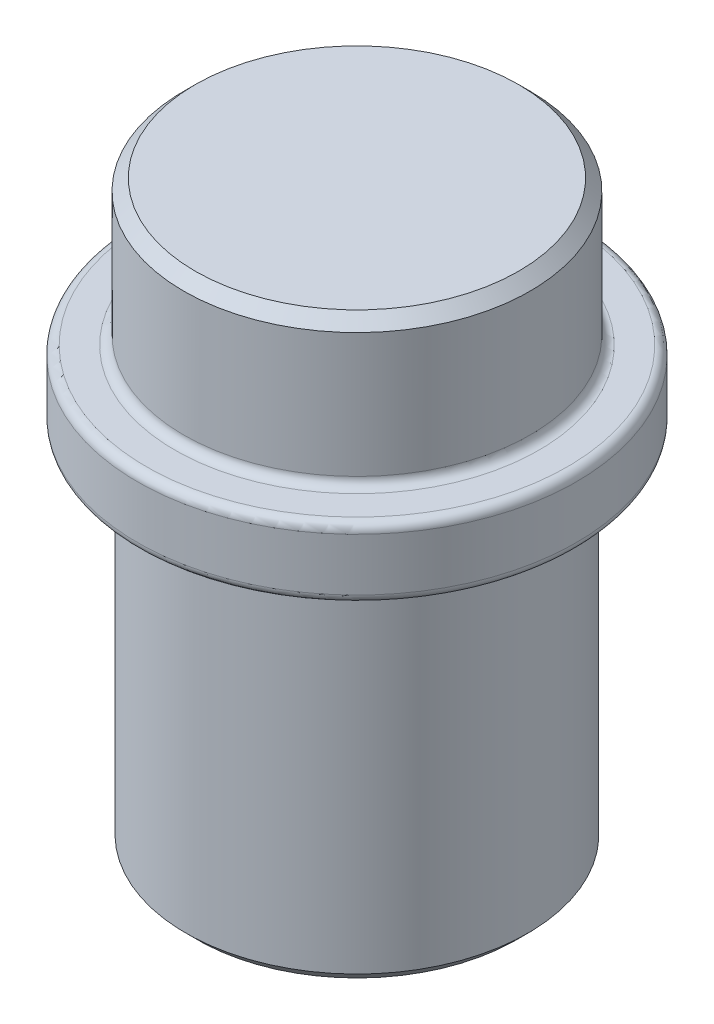
ISO-10303-21;
HEADER;
FILE_DESCRIPTION(('STEP AP214'),'2;1');
FILE_NAME('part.step','',(''),(''),'','','');
FILE_SCHEMA(('AUTOMOTIVE_DESIGN { 1 0 10303 214 1 1 1 1 }'));
ENDSEC;
DATA;
#1=APPLICATION_CONTEXT('core data for automotive mechanical design processes');
#2=APPLICATION_PROTOCOL_DEFINITION('international standard','automotive_design',2000,#1);
#3=PRODUCT_CONTEXT('',#1,'mechanical');
#4=PRODUCT('Part','Part','',(#3));
#5=PRODUCT_RELATED_PRODUCT_CATEGORY('part','',(#4));
#6=PRODUCT_DEFINITION_FORMATION('','',#4);
#7=PRODUCT_DEFINITION_CONTEXT('part definition',#1,'design');
#8=PRODUCT_DEFINITION('design','',#6,#7);
#9=PRODUCT_DEFINITION_SHAPE('','',#8);
#10=(LENGTH_UNIT() NAMED_UNIT(*) SI_UNIT(.MILLI.,.METRE.));
#11=(NAMED_UNIT(*) PLANE_ANGLE_UNIT() SI_UNIT($,.RADIAN.));
#12=(NAMED_UNIT(*) SI_UNIT($,.STERADIAN.) SOLID_ANGLE_UNIT());
#13=UNCERTAINTY_MEASURE_WITH_UNIT(LENGTH_MEASURE(1.E-05),#10,'distance_accuracy_value','');
#14=(GEOMETRIC_REPRESENTATION_CONTEXT(3) GLOBAL_UNCERTAINTY_ASSIGNED_CONTEXT((#13)) GLOBAL_UNIT_ASSIGNED_CONTEXT((#10,
#11,#12)) REPRESENTATION_CONTEXT('',''));
#15=CARTESIAN_POINT('',(0.,0.,0.));
#16=DIRECTION('',(0.,0.,1.));
#17=DIRECTION('',(1.,0.,0.));
#18=AXIS2_PLACEMENT_3D('',#15,#16,#17);
#19=CARTESIAN_POINT('',(0.,-25.4,0.));
#20=DIRECTION('',(0.,-1.,0.));
#21=DIRECTION('',(0.,0.,-1.));
#22=AXIS2_PLACEMENT_3D('',#19,#20,#21);
#23=CYLINDRICAL_SURFACE('',#22,7.5311);
#24=CARTESIAN_POINT('',(0.,69.34962,0.));
#25=DIRECTION('',(0.,-1.,0.));
#26=DIRECTION('',(0.,0.,-1.));
#27=AXIS2_PLACEMENT_3D('',#24,#25,#26);
#28=CIRCLE('',#27,7.5311);
#29=CARTESIAN_POINT('',(0.,69.34962,-7.5311));
#30=VERTEX_POINT('',#29);
#31=EDGE_CURVE('E191',#30,#30,#28,.T.);
#32=ORIENTED_EDGE('',*,*,#31,.T.);
#33=EDGE_LOOP('',(#32));
#34=FACE_BOUND('',#33,.T.);
#35=CARTESIAN_POINT('',(0.,66.04,0.));
#36=DIRECTION('',(0.,1.,0.));
#37=DIRECTION('',(0.,0.,1.));
#38=AXIS2_PLACEMENT_3D('',#35,#36,#37);
#39=CIRCLE('',#38,7.5311);
#40=CARTESIAN_POINT('',(-7.19565243901508,66.04,2.22262304201505));
#41=VERTEX_POINT('',#40);
#42=CARTESIAN_POINT('',(-7.1964932060148,66.04,-2.21989926478269));
#43=VERTEX_POINT('',#42);
#44=EDGE_CURVE('E11',#41,#43,#39,.F.);
#45=ORIENTED_EDGE('',*,*,#44,.F.);
#46=DIRECTION('',(0.,-1.,0.));
#47=VECTOR('',#46,1.);
#48=CARTESIAN_POINT('',(-7.19565243901498,64.9859,2.22262304201538));
#49=LINE('',#48,#47);
#50=CARTESIAN_POINT('',(-7.19565243901507,63.9317999999979,2.22262304201508));
#51=VERTEX_POINT('',#50);
#52=EDGE_CURVE('E149',#41,#51,#49,.T.);
#53=ORIENTED_EDGE('',*,*,#52,.T.);
#54=CARTESIAN_POINT('',(0.,63.9318,0.));
#55=DIRECTION('',(0.,-1.,0.));
#56=DIRECTION('',(0.,0.,-1.));
#57=AXIS2_PLACEMENT_3D('',#54,#55,#56);
#58=CIRCLE('',#57,7.5311);
#59=CARTESIAN_POINT('',(-7.19649320601479,63.9318000000152,-2.21989926478274));
#60=VERTEX_POINT('',#59);
#61=EDGE_CURVE('E188',#60,#51,#58,.T.);
#62=ORIENTED_EDGE('',*,*,#61,.F.);
#63=DIRECTION('',(0.,-1.,0.));
#64=VECTOR('',#63,1.);
#65=CARTESIAN_POINT('',(-7.19649320601468,64.9859,-2.21989926478307));
#66=LINE('',#65,#64);
#67=EDGE_CURVE('E124',#60,#43,#66,.F.);
#68=ORIENTED_EDGE('',*,*,#67,.T.);
#69=EDGE_LOOP('',(#45,#53,#62,#68));
#70=FACE_BOUND('',#69,.T.);
#71=ADVANCED_FACE('F43',(#34,#70),#23,.T.);
#72=CARTESIAN_POINT('',(0.,63.9318,0.));
#73=DIRECTION('',(0.,-1.,0.));
#74=DIRECTION('',(0.,0.,-1.));
#75=AXIS2_PLACEMENT_3D('',#72,#73,#74);
#76=TOROIDAL_SURFACE('',#75,7.9121,0.381000000000004);
#77=ORIENTED_EDGE('',*,*,#61,.T.);
#78=CARTESIAN_POINT('',(-7.19565392150481,63.932,2.222618420377));
#79=CARTESIAN_POINT('',(-7.19564887805347,63.9316982296135,2.22263415915682));
#80=CARTESIAN_POINT('',(-7.19565508411614,63.9313972408078,2.2226147958262));
#81=CARTESIAN_POINT('',(-7.19568550587122,63.9308125680004,2.22251996706615));
#82=CARTESIAN_POINT('',(-7.19570926468576,63.9305286391639,2.22244592488398));
#83=CARTESIAN_POINT('',(-7.19578182753611,63.9298755776215,2.22221993724098));
#84=CARTESIAN_POINT('',(-7.19583665542731,63.9295139529192,2.22204927388934));
#85=CARTESIAN_POINT('',(-7.19596248814146,63.9288176984729,2.22165806257884));
#86=CARTESIAN_POINT('',(-7.19603368395775,63.9284834562325,2.22143692589767));
#87=CARTESIAN_POINT('',(-7.19637441752574,63.9270237920419,2.22038015406093));
#88=CARTESIAN_POINT('',(-7.19669251800118,63.9260223633533,2.21939760035131));
#89=CARTESIAN_POINT('',(-7.19735620851469,63.9241152038425,2.21735942010747));
#90=CARTESIAN_POINT('',(-7.1977019198329,63.9232099410894,2.21630347416516));
#91=CARTESIAN_POINT('',(-7.20081427695179,63.9153006868265,2.20685472456738));
#92=CARTESIAN_POINT('',(-7.20389747793767,63.9091206552501,2.19789127203985));
#93=CARTESIAN_POINT('',(-7.21349965653869,63.8905170773389,2.17121316786694));
#94=CARTESIAN_POINT('',(-7.22037006911947,63.878032602792,2.1537146024011));
#95=CARTESIAN_POINT('',(-7.23516544839203,63.8533579960951,2.1189477512049));
#96=CARTESIAN_POINT('',(-7.24308962650045,63.8411676518154,2.10167930379566));
#97=CARTESIAN_POINT('',(-7.26465307332196,63.8102562936931,2.05802766336985));
#98=CARTESIAN_POINT('',(-7.27902240155873,63.7916678944851,2.0319080671607));
#99=CARTESIAN_POINT('',(-7.31032870972903,63.755344624653,1.9806214980743));
#100=CARTESIAN_POINT('',(-7.32726771142415,63.7376104407102,1.95545529496297));
#101=CARTESIAN_POINT('',(-7.38202256084108,63.6862844299909,1.88172312915843));
#102=CARTESIAN_POINT('',(-7.42387504693956,63.654419664563,1.83471836776791));
#103=CARTESIAN_POINT('',(-7.49470368921049,63.614054797531,1.76948420666288));
#104=CARTESIAN_POINT('',(-7.51938743488396,63.6019186381813,1.74878829227356));
#105=CARTESIAN_POINT('',(-7.57155672542215,63.5807995437159,1.70928957199155));
#106=CARTESIAN_POINT('',(-7.59904386707893,63.5718184187719,1.69048785727571));
#107=CARTESIAN_POINT('',(-7.65699596492557,63.5580537363401,1.65505861739462));
#108=CARTESIAN_POINT('',(-7.68749821740486,63.5533327217491,1.63846644289689));
#109=CARTESIAN_POINT('',(-7.75030380168546,63.5498207445377,1.60849989643333));
#110=CARTESIAN_POINT('',(-7.78259664982927,63.5509982608332,1.59510882010798));
#111=CARTESIAN_POINT('',(-7.83131254617507,63.5582682635789,1.5777767048861));
#112=CARTESIAN_POINT('',(-7.84766691389278,63.561634914718,1.5724418100122));
#113=CARTESIAN_POINT('',(-7.88020622664097,63.5703711323364,1.56271373343094));
#114=CARTESIAN_POINT('',(-7.89638998775283,63.5757501982905,1.55832517624662));
#115=CARTESIAN_POINT('',(-7.9123,63.5821921897,1.55443093974947));
#116=B_SPLINE_CURVE_WITH_KNOTS('',3,(#78,#79,#80,#81,#82,#83,#84,#85,#86,#87,#88,#89,#90,#91,
#92,#93,#94,#95,#96,#97,#98,#99,#100,#101,#102,#103,#104,#105,#106,#107,#108,#109,#110,#111,
#112,#113,#114,#115),.UNSPECIFIED.,.F.,.F.,(4,2,2,2,2,2,2,2,2,2,2,2,2,2,2,2,2,2,4),(0.,
0.00090045342468098,0.00177825994486462,0.00298200107736237,0.00420057355602642,
0.00848338047893281,0.012786160390775,0.0466467514337602,0.114382071607839,0.182066984485264,
0.287338335510166,0.39269294540657,0.602593502708833,0.7056315327309,0.808728583687365,
0.913315682308793,1.01734447741844,1.06980368325487,1.12251370963707),.UNSPECIFIED.);
#117=CARTESIAN_POINT('',(-7.74638180037426,63.5508,1.61086790669825));
#118=VERTEX_POINT('',#117);
#119=EDGE_CURVE('E142',#51,#118,#116,.T.);
#120=ORIENTED_EDGE('',*,*,#119,.T.);
#121=CARTESIAN_POINT('',(0.,63.5508,0.));
#122=DIRECTION('',(0.,-1.,0.));
#123=DIRECTION('',(0.,0.,-1.));
#124=AXIS2_PLACEMENT_3D('',#121,#122,#123);
#125=CIRCLE('',#124,7.9121);
#126=CARTESIAN_POINT('',(-7.74650459269297,63.5508,-1.61027730698371));
#127=VERTEX_POINT('',#126);
#128=EDGE_CURVE('E185',#127,#118,#125,.T.);
#129=ORIENTED_EDGE('',*,*,#128,.F.);
#130=CARTESIAN_POINT('',(-7.9123,63.5821922487398,-1.55443164676201));
#131=CARTESIAN_POINT('',(-7.88976496843398,63.5730459925189,-1.55984145030963));
#132=CARTESIAN_POINT('',(-7.86671105132023,63.566068132639,-1.56627759626164));
#133=CARTESIAN_POINT('',(-7.82058421192799,63.5560633913314,-1.58100671511895));
#134=CARTESIAN_POINT('',(-7.79751366957904,63.5529986262405,-1.58928095915709));
#135=CARTESIAN_POINT('',(-7.74686317635095,63.5499719094482,-1.60962475245245));
#136=CARTESIAN_POINT('',(-7.7194130873967,63.5508450935852,-1.62212893334892));
#137=CARTESIAN_POINT('',(-7.66603961769109,63.5566710018842,-1.64939185229539));
#138=CARTESIAN_POINT('',(-7.6401226963378,63.5616398280319,-1.66415930150468));
#139=CARTESIAN_POINT('',(-7.57982882653366,63.5775077906599,-1.70210902017465));
#140=CARTESIAN_POINT('',(-7.54646839693582,63.5900208904836,-1.72622113986055));
#141=CARTESIAN_POINT('',(-7.48407606067448,63.6193962958821,-1.77720322072982));
#142=CARTESIAN_POINT('',(-7.45505319512952,63.6362674911609,-1.80407875050084));
#143=CARTESIAN_POINT('',(-7.38764288788742,63.6821746774853,-1.87404831693592));
#144=CARTESIAN_POINT('',(-7.35191619652075,63.7130541685286,-1.91848516915673));
#145=CARTESIAN_POINT('',(-7.28937660096177,63.7781792995054,-2.0108038524957));
#146=CARTESIAN_POINT('',(-7.26255671484251,63.8124222754315,-2.05868294929559));
#147=CARTESIAN_POINT('',(-7.23348686574313,63.8573685412151,-2.12200085905956));
#148=CARTESIAN_POINT('',(-7.22736363250432,63.8674278061453,-2.1362013566518));
#149=CARTESIAN_POINT('',(-7.21793238996297,63.8839433249014,-2.15954595521695));
#150=CARTESIAN_POINT('',(-7.21441693545656,63.89036473938,-2.16862987750942));
#151=CARTESIAN_POINT('',(-7.20894327082859,63.9008525105362,-2.18341026914401));
#152=CARTESIAN_POINT('',(-7.20689770102963,63.9048938878128,-2.1890924870053));
#153=CARTESIAN_POINT('',(-7.20368304432382,63.9115173939244,-2.19828141052459));
#154=CARTESIAN_POINT('',(-7.20247607482472,63.9140709363366,-2.20179492865012));
#155=CARTESIAN_POINT('',(-7.20057052223172,63.918306870803,-2.20744287779158));
#156=CARTESIAN_POINT('',(-7.19985204895762,63.919954160814,-2.20959713689689));
#157=CARTESIAN_POINT('',(-7.19871732003669,63.9227465992726,-2.21303753487519));
#158=CARTESIAN_POINT('',(-7.19828771928923,63.9238516624994,-2.21434959178583));
#159=CARTESIAN_POINT('',(-7.19767519583938,63.9256235150572,-2.21623254437705));
#160=CARTESIAN_POINT('',(-7.19747542149911,63.926236514628,-2.21684885600262));
#161=CARTESIAN_POINT('',(-7.19709916890756,63.9275327213009,-2.21801321567947));
#162=CARTESIAN_POINT('',(-7.1969225568408,63.9282154805172,-2.2185616547096));
#163=CARTESIAN_POINT('',(-7.19672975436063,63.929219589595,-2.21916166244581));
#164=CARTESIAN_POINT('',(-7.19668484907151,63.9294803493572,-2.21930154349647));
#165=CARTESIAN_POINT('',(-7.19660667457906,63.9300185933403,-2.21954519938292));
#166=CARTESIAN_POINT('',(-7.19657333456141,63.9302959631308,-2.21964919393109));
#167=CARTESIAN_POINT('',(-7.19652770443402,63.9308092356625,-2.21979156788783));
#168=CARTESIAN_POINT('',(-7.19651253416542,63.9310423028534,-2.21983892230518));
#169=CARTESIAN_POINT('',(-7.19649399541484,63.9315169286096,-2.21989680062555));
#170=CARTESIAN_POINT('',(-7.19649081184256,63.9317585626208,-2.2199067474675));
#171=CARTESIAN_POINT('',(-7.19649469408532,63.9320000001165,-2.21989461882009));
#172=B_SPLINE_CURVE_WITH_KNOTS('',3,(#130,#131,#132,#133,#134,#135,#136,#137,#138,#139,#140,
#141,#142,#143,#144,#145,#146,#147,#148,#149,#150,#151,#152,#153,#154,#155,#156,#157,#158,#159,
#160,#161,#162,#163,#164,#165,#166,#167,#168,#169,#170,#171),.UNSPECIFIED.,.F.,.F.,(4,2,2,2,2,2,
2,2,2,2,2,2,2,2,2,2,2,2,2,2,4),(0.,0.0744747040376915,0.148222792514042,0.238264706269916,
0.328662317120564,0.457013237484078,0.585628066203248,0.779117917401475,0.972455734463609,
1.02779283861518,1.06278802075029,1.08458766980801,1.09810986688792,1.10652659593674,
1.1118248711336,1.11450076497588,1.11716044577238,1.11805634404342,1.11894665565747,
1.11965846797852,1.12038121693569),.UNSPECIFIED.);
#173=EDGE_CURVE('E102',#127,#60,#172,.T.);
#174=ORIENTED_EDGE('',*,*,#173,.T.);
#175=EDGE_LOOP('',(#77,#120,#129,#174));
#176=FACE_BOUND('',#175,.T.);
#177=ADVANCED_FACE('F126',(#176),#76,.F.);
#178=CARTESIAN_POINT('',(7.03072,69.85,0.));
#179=DIRECTION('',(0.,1.,0.));
#180=DIRECTION('',(0.,0.,1.));
#181=AXIS2_PLACEMENT_3D('',#178,#179,#180);
#182=PLANE('',#181);
#183=CARTESIAN_POINT('',(0.,69.85,0.));
#184=DIRECTION('',(0.,-1.,0.));
#185=DIRECTION('',(0.,0.,-1.));
#186=AXIS2_PLACEMENT_3D('',#183,#184,#185);
#187=CIRCLE('',#186,7.03072);
#188=CARTESIAN_POINT('',(0.,69.85,-7.03072));
#189=VERTEX_POINT('',#188);
#190=EDGE_CURVE('E194',#189,#189,#187,.T.);
#191=ORIENTED_EDGE('',*,*,#190,.F.);
#192=EDGE_LOOP('',(#191));
#193=FACE_BOUND('',#192,.T.);
#194=ADVANCED_FACE('F45',(#193),#182,.T.);
#195=CARTESIAN_POINT('',(0.,69.34962,0.));
#196=DIRECTION('',(0.,-1.,0.));
#197=DIRECTION('',(0.,0.,-1.));
#198=AXIS2_PLACEMENT_3D('',#195,#196,#197);
#199=CONICAL_SURFACE('',#198,7.5311,0.785398163397453);
#200=ORIENTED_EDGE('',*,*,#190,.T.);
#201=EDGE_LOOP('',(#200));
#202=FACE_BOUND('',#201,.T.);
#203=ORIENTED_EDGE('',*,*,#31,.F.);
#204=EDGE_LOOP('',(#203));
#205=FACE_BOUND('',#204,.T.);
#206=ADVANCED_FACE('F210',(#202,#205),#199,.T.);
#207=CARTESIAN_POINT('',(9.1567,63.5508,0.));
#208=DIRECTION('',(0.,1.,0.));
#209=DIRECTION('',(0.,0.,1.));
#210=AXIS2_PLACEMENT_3D('',#207,#208,#209);
#211=PLANE('',#210);
#212=ORIENTED_EDGE('',*,*,#128,.T.);
#213=CARTESIAN_POINT('',(-8.15129724862775,63.5508,2.52916410286336));
#214=DIRECTION('',(0.,-1.,0.));
#215=DIRECTION('',(0.,0.,1.));
#216=AXIS2_PLACEMENT_3D('',#213,#214,#215);
#217=CIRCLE('',#216,1.00360571148516);
#218=CARTESIAN_POINT('',(-7.9121,63.5508,1.55448));
#219=VERTEX_POINT('',#218);
#220=EDGE_CURVE('E112',#219,#118,#217,.T.);
#221=ORIENTED_EDGE('',*,*,#220,.F.);
#222=CARTESIAN_POINT('',(-7.530719,63.5508,0.));
#223=DIRECTION('',(0.,1.,0.));
#224=DIRECTION('',(0.,0.,-1.));
#225=AXIS2_PLACEMENT_3D('',#222,#223,#224);
#226=CIRCLE('',#225,1.600581);
#227=CARTESIAN_POINT('',(-7.9121,63.5508,-1.55448));
#228=VERTEX_POINT('',#227);
#229=EDGE_CURVE('E114',#228,#219,#226,.T.);
#230=ORIENTED_EDGE('',*,*,#229,.F.);
#231=CARTESIAN_POINT('',(-8.14665828474617,63.5508,-2.52422866384649));
#232=DIRECTION('',(0.,1.,0.));
#233=DIRECTION('',(0.,0.,1.));
#234=AXIS2_PLACEMENT_3D('',#231,#232,#233);
#235=CIRCLE('',#234,0.997712413461473);
#236=EDGE_CURVE('E51',#228,#127,#235,.T.);
#237=ORIENTED_EDGE('',*,*,#236,.T.);
#238=EDGE_LOOP('',(#212,#221,#230,#237));
#239=FACE_BOUND('',#238,.T.);
#240=CARTESIAN_POINT('',(0.,63.5508,0.));
#241=DIRECTION('',(0.,-1.,0.));
#242=DIRECTION('',(0.,0.,-1.));
#243=AXIS2_PLACEMENT_3D('',#240,#241,#242);
#244=CIRCLE('',#243,9.1567);
#245=CARTESIAN_POINT('',(0.,63.5508,-9.1567));
#246=VERTEX_POINT('',#245);
#247=EDGE_CURVE('E182',#246,#246,#244,.T.);
#248=ORIENTED_EDGE('',*,*,#247,.F.);
#249=EDGE_LOOP('',(#248));
#250=FACE_BOUND('',#249,.T.);
#251=ADVANCED_FACE('F198',(#239,#250),#211,.T.);
#252=CARTESIAN_POINT('',(0.,63.1698,0.));
#253=DIRECTION('',(0.,-1.,0.));
#254=DIRECTION('',(0.,0.,-1.));
#255=AXIS2_PLACEMENT_3D('',#252,#253,#254);
#256=TOROIDAL_SURFACE('',#255,9.15670000000003,0.380999999999966);
#257=ORIENTED_EDGE('',*,*,#247,.T.);
#258=EDGE_LOOP('',(#257));
#259=FACE_BOUND('',#258,.T.);
#260=CARTESIAN_POINT('',(0.,63.1698,0.));
#261=DIRECTION('',(0.,-1.,0.));
#262=DIRECTION('',(0.,0.,-1.));
#263=AXIS2_PLACEMENT_3D('',#260,#261,#262);
#264=CIRCLE('',#263,9.5377);
#265=CARTESIAN_POINT('',(0.,63.1698,-9.5377));
#266=VERTEX_POINT('',#265);
#267=EDGE_CURVE('E179',#266,#266,#264,.T.);
#268=ORIENTED_EDGE('',*,*,#267,.F.);
#269=EDGE_LOOP('',(#268));
#270=FACE_BOUND('',#269,.T.);
#271=ADVANCED_FACE('F218',(#259,#270),#256,.T.);
#272=CARTESIAN_POINT('',(0.,-25.4,0.));
#273=DIRECTION('',(0.,-1.,0.));
#274=DIRECTION('',(0.,0.,-1.));
#275=AXIS2_PLACEMENT_3D('',#272,#273,#274);
#276=CYLINDRICAL_SURFACE('',#275,9.5377);
#277=ORIENTED_EDGE('',*,*,#267,.T.);
#278=EDGE_LOOP('',(#277));
#279=FACE_BOUND('',#278,.T.);
#280=CARTESIAN_POINT('',(0.,60.8838,0.));
#281=DIRECTION('',(0.,-1.,0.));
#282=DIRECTION('',(0.,0.,-1.));
#283=AXIS2_PLACEMENT_3D('',#280,#281,#282);
#284=CIRCLE('',#283,9.5377);
#285=CARTESIAN_POINT('',(0.,60.8838,-9.5377));
#286=VERTEX_POINT('',#285);
#287=EDGE_CURVE('E176',#286,#286,#284,.T.);
#288=ORIENTED_EDGE('',*,*,#287,.F.);
#289=EDGE_LOOP('',(#288));
#290=FACE_BOUND('',#289,.T.);
#291=ADVANCED_FACE('F244',(#279,#290),#276,.T.);
#292=CARTESIAN_POINT('',(0.,60.8838,0.));
#293=DIRECTION('',(0.,-1.,0.));
#294=DIRECTION('',(0.,0.,-1.));
#295=AXIS2_PLACEMENT_3D('',#292,#293,#294);
#296=TOROIDAL_SURFACE('',#295,9.15669999999999,0.381000000000012);
#297=ORIENTED_EDGE('',*,*,#287,.T.);
#298=EDGE_LOOP('',(#297));
#299=FACE_BOUND('',#298,.T.);
#300=CARTESIAN_POINT('',(0.,60.5028,0.));
#301=DIRECTION('',(0.,-1.,0.));
#302=DIRECTION('',(0.,0.,-1.));
#303=AXIS2_PLACEMENT_3D('',#300,#301,#302);
#304=CIRCLE('',#303,9.1567);
#305=CARTESIAN_POINT('',(0.,60.5028,-9.1567));
#306=VERTEX_POINT('',#305);
#307=EDGE_CURVE('E173',#306,#306,#304,.T.);
#308=ORIENTED_EDGE('',*,*,#307,.F.);
#309=EDGE_LOOP('',(#308));
#310=FACE_BOUND('',#309,.T.);
#311=ADVANCED_FACE('F254',(#299,#310),#296,.T.);
#312=CARTESIAN_POINT('',(7.81939,60.5028,0.));
#313=DIRECTION('',(0.,-1.,0.));
#314=DIRECTION('',(0.,0.,-1.));
#315=AXIS2_PLACEMENT_3D('',#312,#313,#314);
#316=PLANE('',#315);
#317=ORIENTED_EDGE('',*,*,#307,.T.);
#318=EDGE_LOOP('',(#317));
#319=FACE_BOUND('',#318,.T.);
#320=CARTESIAN_POINT('',(0.,60.5028,0.));
#321=DIRECTION('',(0.,-1.,0.));
#322=DIRECTION('',(0.,0.,-1.));
#323=AXIS2_PLACEMENT_3D('',#320,#321,#322);
#324=CIRCLE('',#323,7.81939);
#325=CARTESIAN_POINT('',(0.,60.5028,-7.81939));
#326=VERTEX_POINT('',#325);
#327=EDGE_CURVE('E170',#326,#326,#324,.T.);
#328=ORIENTED_EDGE('',*,*,#327,.F.);
#329=EDGE_LOOP('',(#328));
#330=FACE_BOUND('',#329,.T.);
#331=ADVANCED_FACE('F264',(#319,#330),#316,.T.);
#332=CARTESIAN_POINT('',(0.,60.1218,0.));
#333=DIRECTION('',(0.,-1.,0.));
#334=DIRECTION('',(0.,0.,-1.));
#335=AXIS2_PLACEMENT_3D('',#332,#333,#334);
#336=TOROIDAL_SURFACE('',#335,7.81939,0.381000000000001);
#337=ORIENTED_EDGE('',*,*,#327,.T.);
#338=EDGE_LOOP('',(#337));
#339=FACE_BOUND('',#338,.T.);
#340=CARTESIAN_POINT('',(0.,60.1218,0.));
#341=DIRECTION('',(0.,-1.,0.));
#342=DIRECTION('',(0.,0.,-1.));
#343=AXIS2_PLACEMENT_3D('',#340,#341,#342);
#344=CIRCLE('',#343,7.43839);
#345=CARTESIAN_POINT('',(0.,60.1218,-7.43839));
#346=VERTEX_POINT('',#345);
#347=EDGE_CURVE('E167',#346,#346,#344,.T.);
#348=ORIENTED_EDGE('',*,*,#347,.F.);
#349=EDGE_LOOP('',(#348));
#350=FACE_BOUND('',#349,.T.);
#351=ADVANCED_FACE('F274',(#339,#350),#336,.F.);
#352=CARTESIAN_POINT('',(0.,-25.4,0.));
#353=DIRECTION('',(0.,-1.,0.));
#354=DIRECTION('',(0.,0.,-1.));
#355=AXIS2_PLACEMENT_3D('',#352,#353,#354);
#356=CYLINDRICAL_SURFACE('',#355,7.43839);
#357=ORIENTED_EDGE('',*,*,#347,.T.);
#358=EDGE_LOOP('',(#357));
#359=FACE_BOUND('',#358,.T.);
#360=CARTESIAN_POINT('',(0.,45.12818,0.));
#361=DIRECTION('',(0.,-1.,0.));
#362=DIRECTION('',(0.,0.,-1.));
#363=AXIS2_PLACEMENT_3D('',#360,#361,#362);
#364=CIRCLE('',#363,7.43839);
#365=CARTESIAN_POINT('',(0.,45.12818,-7.43839));
#366=VERTEX_POINT('',#365);
#367=EDGE_CURVE('E164',#366,#366,#364,.T.);
#368=ORIENTED_EDGE('',*,*,#367,.F.);
#369=EDGE_LOOP('',(#368));
#370=FACE_BOUND('',#369,.T.);
#371=ADVANCED_FACE('F284',(#359,#370),#356,.T.);
#372=CARTESIAN_POINT('',(0.,44.6278,0.));
#373=DIRECTION('',(0.,1.,0.));
#374=DIRECTION('',(0.,0.,1.));
#375=AXIS2_PLACEMENT_3D('',#372,#373,#374);
#376=CONICAL_SURFACE('',#375,6.93928,0.784127516050797);
#377=ORIENTED_EDGE('',*,*,#367,.T.);
#378=EDGE_LOOP('',(#377));
#379=FACE_BOUND('',#378,.T.);
#380=CARTESIAN_POINT('',(0.,44.6278,0.));
#381=DIRECTION('',(0.,-1.,0.));
#382=DIRECTION('',(0.,0.,-1.));
#383=AXIS2_PLACEMENT_3D('',#380,#381,#382);
#384=CIRCLE('',#383,6.93928);
#385=CARTESIAN_POINT('',(0.,44.6278,-6.93928));
#386=VERTEX_POINT('',#385);
#387=EDGE_CURVE('E161',#386,#386,#384,.T.);
#388=ORIENTED_EDGE('',*,*,#387,.F.);
#389=EDGE_LOOP('',(#388));
#390=FACE_BOUND('',#389,.T.);
#391=ADVANCED_FACE('F294',(#379,#390),#376,.T.);
#392=CARTESIAN_POINT('',(6.49478,44.6278,0.));
#393=DIRECTION('',(0.,-1.,0.));
#394=DIRECTION('',(0.,0.,-1.));
#395=AXIS2_PLACEMENT_3D('',#392,#393,#394);
#396=PLANE('',#395);
#397=ORIENTED_EDGE('',*,*,#387,.T.);
#398=EDGE_LOOP('',(#397));
#399=FACE_BOUND('',#398,.T.);
#400=CARTESIAN_POINT('',(0.,44.6278,0.));
#401=DIRECTION('',(0.,-1.,0.));
#402=DIRECTION('',(0.,0.,-1.));
#403=AXIS2_PLACEMENT_3D('',#400,#401,#402);
#404=CIRCLE('',#403,6.49478);
#405=CARTESIAN_POINT('',(0.,44.6278,-6.49478));
#406=VERTEX_POINT('',#405);
#407=EDGE_CURVE('E158',#406,#406,#404,.T.);
#408=ORIENTED_EDGE('',*,*,#407,.F.);
#409=EDGE_LOOP('',(#408));
#410=FACE_BOUND('',#409,.T.);
#411=ADVANCED_FACE('F304',(#399,#410),#396,.T.);
#412=CARTESIAN_POINT('',(0.,45.12818,0.));
#413=DIRECTION('',(0.,-1.,0.));
#414=DIRECTION('',(0.,0.,-1.));
#415=AXIS2_PLACEMENT_3D('',#412,#413,#414);
#416=CONICAL_SURFACE('',#415,5.9944,0.785398163397453);
#417=ORIENTED_EDGE('',*,*,#407,.T.);
#418=EDGE_LOOP('',(#417));
#419=FACE_BOUND('',#418,.T.);
#420=CARTESIAN_POINT('',(0.,45.12818,0.));
#421=DIRECTION('',(0.,-1.,0.));
#422=DIRECTION('',(0.,0.,-1.));
#423=AXIS2_PLACEMENT_3D('',#420,#421,#422);
#424=CIRCLE('',#423,5.9944);
#425=CARTESIAN_POINT('',(0.,45.12818,-5.9944));
#426=VERTEX_POINT('',#425);
#427=EDGE_CURVE('E155',#426,#426,#424,.T.);
#428=ORIENTED_EDGE('',*,*,#427,.F.);
#429=EDGE_LOOP('',(#428));
#430=FACE_BOUND('',#429,.T.);
#431=ADVANCED_FACE('F314',(#419,#430),#416,.F.);
#432=CARTESIAN_POINT('',(0.,-25.4,0.));
#433=DIRECTION('',(0.,-1.,0.));
#434=DIRECTION('',(0.,0.,-1.));
#435=AXIS2_PLACEMENT_3D('',#432,#433,#434);
#436=CYLINDRICAL_SURFACE('',#435,5.9944);
#437=ORIENTED_EDGE('',*,*,#427,.T.);
#438=EDGE_LOOP('',(#437));
#439=FACE_BOUND('',#438,.T.);
#440=CARTESIAN_POINT('',(0.,52.64912,0.));
#441=DIRECTION('',(0.,-1.,0.));
#442=DIRECTION('',(0.,0.,-1.));
#443=AXIS2_PLACEMENT_3D('',#440,#441,#442);
#444=CIRCLE('',#443,5.9944);
#445=CARTESIAN_POINT('',(0.,52.64912,-5.9944));
#446=VERTEX_POINT('',#445);
#447=EDGE_CURVE('E152',#446,#446,#444,.T.);
#448=ORIENTED_EDGE('',*,*,#447,.F.);
#449=EDGE_LOOP('',(#448));
#450=FACE_BOUND('',#449,.T.);
#451=ADVANCED_FACE('F324',(#439,#450),#436,.F.);
#452=CARTESIAN_POINT('',(0.,54.2544,0.));
#453=DIRECTION('',(0.,-1.,0.));
#454=DIRECTION('',(0.,0.,-1.));
#455=AXIS2_PLACEMENT_3D('',#452,#453,#454);
#456=CONICAL_SURFACE('',#455,0.,1.30913930561363);
#457=ORIENTED_EDGE('',*,*,#447,.T.);
#458=EDGE_LOOP('',(#457));
#459=FACE_BOUND('',#458,.T.);
#460=CARTESIAN_POINT('',(0.,54.2544,0.));
#461=VERTEX_POINT('',#460);
#462=VERTEX_LOOP('',#461);
#463=FACE_BOUND('',#462,.T.);
#464=ADVANCED_FACE('F139',(#459,#463),#456,.F.);
#465=CARTESIAN_POINT('',(-8.15129724862775,66.04,2.52916410286336));
#466=DIRECTION('',(0.,-1.,0.));
#467=DIRECTION('',(0.,0.,-1.));
#468=AXIS2_PLACEMENT_3D('',#465,#466,#467);
#469=CYLINDRICAL_SURFACE('',#468,1.00360571148516);
#470=ORIENTED_EDGE('',*,*,#52,.F.);
#471=CARTESIAN_POINT('',(-8.15129724862775,66.04,2.52916410286336));
#472=DIRECTION('',(0.,-1.,0.));
#473=DIRECTION('',(0.,0.,1.));
#474=AXIS2_PLACEMENT_3D('',#471,#472,#473);
#475=CIRCLE('',#474,1.00360571148516);
#476=CARTESIAN_POINT('',(-7.9121,66.04,1.55448));
#477=VERTEX_POINT('',#476);
#478=EDGE_CURVE('E97',#477,#41,#475,.T.);
#479=ORIENTED_EDGE('',*,*,#478,.F.);
#480=DIRECTION('',(0.,-1.,0.));
#481=VECTOR('',#480,1.);
#482=CARTESIAN_POINT('',(-7.9121,66.04,1.55448));
#483=LINE('',#482,#481);
#484=EDGE_CURVE('E103',#477,#219,#483,.T.);
#485=ORIENTED_EDGE('',*,*,#484,.T.);
#486=ORIENTED_EDGE('',*,*,#220,.T.);
#487=ORIENTED_EDGE('',*,*,#119,.F.);
#488=EDGE_LOOP('',(#470,#479,#485,#486,#487));
#489=FACE_BOUND('',#488,.T.);
#490=ADVANCED_FACE('F134',(#489),#469,.F.);
#491=CARTESIAN_POINT('',(-8.14665828474617,66.04,-2.52422866384649));
#492=DIRECTION('',(0.,-1.,0.));
#493=DIRECTION('',(0.,0.,-1.));
#494=AXIS2_PLACEMENT_3D('',#491,#492,#493);
#495=CYLINDRICAL_SURFACE('',#494,0.997712413461473);
#496=ORIENTED_EDGE('',*,*,#67,.F.);
#497=ORIENTED_EDGE('',*,*,#173,.F.);
#498=ORIENTED_EDGE('',*,*,#236,.F.);
#499=DIRECTION('',(0.,-1.,0.));
#500=VECTOR('',#499,1.);
#501=CARTESIAN_POINT('',(-7.9121,66.04,-1.55448));
#502=LINE('',#501,#500);
#503=CARTESIAN_POINT('',(-7.9121,66.04,-1.55448));
#504=VERTEX_POINT('',#503);
#505=EDGE_CURVE('E58',#504,#228,#502,.T.);
#506=ORIENTED_EDGE('',*,*,#505,.F.);
#507=CARTESIAN_POINT('',(-8.14665828474617,66.04,-2.52422866384649));
#508=DIRECTION('',(0.,-1.,0.));
#509=DIRECTION('',(0.,0.,1.));
#510=AXIS2_PLACEMENT_3D('',#507,#508,#509);
#511=CIRCLE('',#510,0.997712413461473);
#512=EDGE_CURVE('E89',#43,#504,#511,.T.);
#513=ORIENTED_EDGE('',*,*,#512,.F.);
#514=EDGE_LOOP('',(#496,#497,#498,#506,#513));
#515=FACE_BOUND('',#514,.T.);
#516=ADVANCED_FACE('F99',(#515),#495,.F.);
#517=CARTESIAN_POINT('',(-7.530719,66.04,0.));
#518=DIRECTION('',(0.,-1.,0.));
#519=DIRECTION('',(0.,0.,-1.));
#520=AXIS2_PLACEMENT_3D('',#517,#518,#519);
#521=CYLINDRICAL_SURFACE('',#520,1.600581);
#522=ORIENTED_EDGE('',*,*,#229,.T.);
#523=ORIENTED_EDGE('',*,*,#484,.F.);
#524=CARTESIAN_POINT('',(-7.530719,66.04,0.));
#525=DIRECTION('',(0.,1.,0.));
#526=DIRECTION('',(0.,0.,-1.));
#527=AXIS2_PLACEMENT_3D('',#524,#525,#526);
#528=CIRCLE('',#527,1.600581);
#529=EDGE_CURVE('E92',#504,#477,#528,.T.);
#530=ORIENTED_EDGE('',*,*,#529,.F.);
#531=ORIENTED_EDGE('',*,*,#505,.T.);
#532=EDGE_LOOP('',(#522,#523,#530,#531));
#533=FACE_BOUND('',#532,.T.);
#534=ADVANCED_FACE('F105',(#533),#521,.T.);
#535=CARTESIAN_POINT('',(-8.15129724862775,66.04,2.52916410286336));
#536=DIRECTION('',(0.,1.,0.));
#537=DIRECTION('',(0.,0.,1.));
#538=AXIS2_PLACEMENT_3D('',#535,#536,#537);
#539=PLANE('',#538);
#540=ORIENTED_EDGE('',*,*,#478,.T.);
#541=ORIENTED_EDGE('',*,*,#44,.T.);
#542=ORIENTED_EDGE('',*,*,#512,.T.);
#543=ORIENTED_EDGE('',*,*,#529,.T.);
#544=EDGE_LOOP('',(#540,#541,#542,#543));
#545=FACE_BOUND('',#544,.T.);
#546=ADVANCED_FACE('F91',(#545),#539,.T.);
#547=CLOSED_SHELL('',(#71,#177,#194,#206,#251,#271,#291,#311,#331,#351,#371,#391,#411,#431,#451,
#464,#490,#516,#534,#546));
#548=MANIFOLD_SOLID_BREP('B2',#547);
#549=ADVANCED_BREP_SHAPE_REPRESENTATION('',(#18,#548),#14);
#550=SHAPE_DEFINITION_REPRESENTATION(#9,#549);
ENDSEC;
END-ISO-10303-21;
